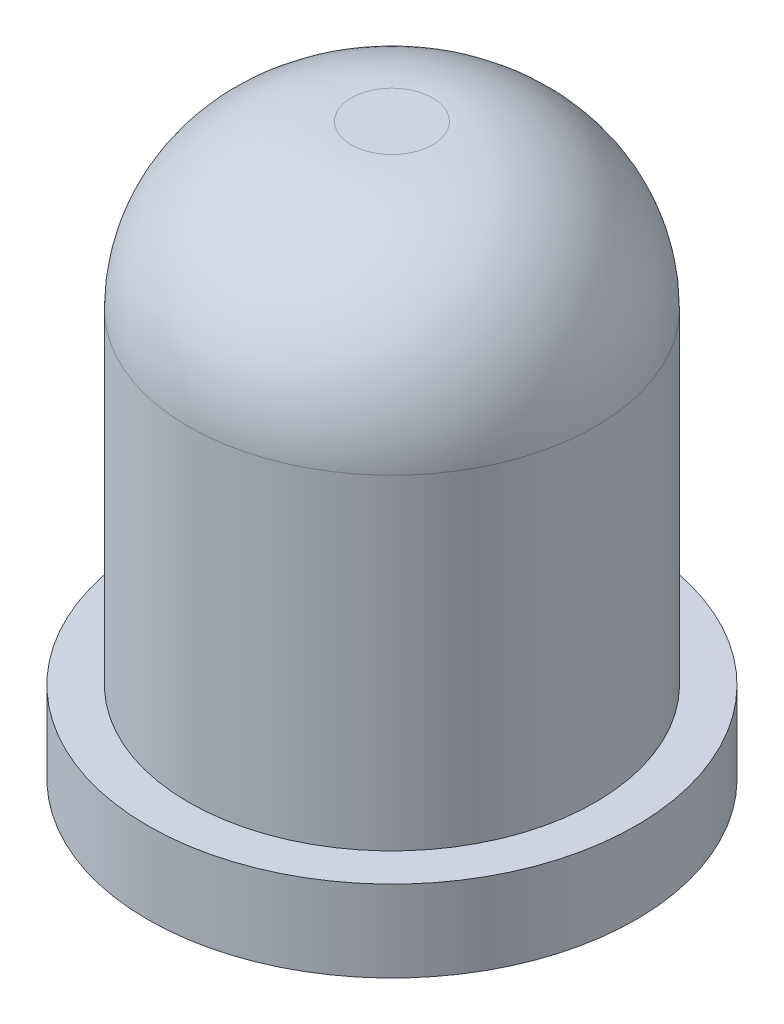
ISO-10303-21;
HEADER;
FILE_DESCRIPTION(('STEP AP214'),'2;1');
FILE_NAME('part.step','',(''),(''),'','','');
FILE_SCHEMA(('AUTOMOTIVE_DESIGN { 1 0 10303 214 1 1 1 1 }'));
ENDSEC;
DATA;
#1=APPLICATION_CONTEXT('core data for automotive mechanical design processes');
#2=APPLICATION_PROTOCOL_DEFINITION('international standard','automotive_design',2000,#1);
#3=PRODUCT_CONTEXT('',#1,'mechanical');
#4=PRODUCT('Part','Part','',(#3));
#5=PRODUCT_RELATED_PRODUCT_CATEGORY('part','',(#4));
#6=PRODUCT_DEFINITION_FORMATION('','',#4);
#7=PRODUCT_DEFINITION_CONTEXT('part definition',#1,'design');
#8=PRODUCT_DEFINITION('design','',#6,#7);
#9=PRODUCT_DEFINITION_SHAPE('','',#8);
#10=(LENGTH_UNIT() NAMED_UNIT(*) SI_UNIT(.MILLI.,.METRE.));
#11=(NAMED_UNIT(*) PLANE_ANGLE_UNIT() SI_UNIT($,.RADIAN.));
#12=(NAMED_UNIT(*) SI_UNIT($,.STERADIAN.) SOLID_ANGLE_UNIT());
#13=UNCERTAINTY_MEASURE_WITH_UNIT(LENGTH_MEASURE(1.E-05),#10,'distance_accuracy_value','');
#14=(GEOMETRIC_REPRESENTATION_CONTEXT(3) GLOBAL_UNCERTAINTY_ASSIGNED_CONTEXT((#13)) GLOBAL_UNIT_ASSIGNED_CONTEXT((#10,
#11,#12)) REPRESENTATION_CONTEXT('',''));
#15=CARTESIAN_POINT('',(0.,0.,0.));
#16=DIRECTION('',(0.,0.,1.));
#17=DIRECTION('',(1.,0.,0.));
#18=AXIS2_PLACEMENT_3D('',#15,#16,#17);
#19=CARTESIAN_POINT('',(0.,1.,0.));
#20=DIRECTION('',(0.,1.,0.));
#21=DIRECTION('',(0.,0.,1.));
#22=AXIS2_PLACEMENT_3D('',#19,#20,#21);
#23=PLANE('',#22);
#24=CARTESIAN_POINT('',(0.,1.,0.));
#25=DIRECTION('',(0.,1.,0.));
#26=DIRECTION('',(0.,0.,1.));
#27=AXIS2_PLACEMENT_3D('',#24,#25,#26);
#28=CIRCLE('',#27,3.);
#29=CARTESIAN_POINT('',(0.,1.,3.));
#30=VERTEX_POINT('',#29);
#31=EDGE_CURVE('E43',#30,#30,#28,.T.);
#32=ORIENTED_EDGE('',*,*,#31,.T.);
#33=EDGE_LOOP('',(#32));
#34=FACE_BOUND('',#33,.T.);
#35=CARTESIAN_POINT('',(0.,1.,0.));
#36=DIRECTION('',(0.,1.,0.));
#37=DIRECTION('',(0.,0.,1.));
#38=AXIS2_PLACEMENT_3D('',#35,#36,#37);
#39=CIRCLE('',#38,2.5);
#40=CARTESIAN_POINT('',(0.,1.,2.5));
#41=VERTEX_POINT('',#40);
#42=EDGE_CURVE('E51',#41,#41,#39,.T.);
#43=ORIENTED_EDGE('',*,*,#42,.F.);
#44=EDGE_LOOP('',(#43));
#45=FACE_BOUND('',#44,.T.);
#46=ADVANCED_FACE('F32',(#34,#45),#23,.T.);
#47=CARTESIAN_POINT('',(0.,1.,0.));
#48=DIRECTION('',(0.,-1.,0.));
#49=DIRECTION('',(0.,0.,-1.));
#50=AXIS2_PLACEMENT_3D('',#47,#48,#49);
#51=CYLINDRICAL_SURFACE('',#50,3.);
#52=ORIENTED_EDGE('',*,*,#31,.F.);
#53=EDGE_LOOP('',(#52));
#54=FACE_BOUND('',#53,.T.);
#55=CARTESIAN_POINT('',(0.,0.,0.));
#56=DIRECTION('',(0.,1.,0.));
#57=DIRECTION('',(0.,0.,1.));
#58=AXIS2_PLACEMENT_3D('',#55,#56,#57);
#59=CIRCLE('',#58,3.);
#60=CARTESIAN_POINT('',(0.,0.,3.));
#61=VERTEX_POINT('',#60);
#62=EDGE_CURVE('E47',#61,#61,#59,.T.);
#63=ORIENTED_EDGE('',*,*,#62,.T.);
#64=EDGE_LOOP('',(#63));
#65=FACE_BOUND('',#64,.T.);
#66=ADVANCED_FACE('F59',(#54,#65),#51,.T.);
#67=CARTESIAN_POINT('',(0.,0.,0.));
#68=DIRECTION('',(0.,1.,0.));
#69=DIRECTION('',(0.,0.,1.));
#70=AXIS2_PLACEMENT_3D('',#67,#68,#69);
#71=PLANE('',#70);
#72=ORIENTED_EDGE('',*,*,#62,.F.);
#73=EDGE_LOOP('',(#72));
#74=FACE_BOUND('',#73,.T.);
#75=ADVANCED_FACE('F65',(#74),#71,.F.);
#76=CARTESIAN_POINT('',(0.,7.,0.));
#77=DIRECTION('',(0.,-1.,0.));
#78=DIRECTION('',(0.,0.,-1.));
#79=AXIS2_PLACEMENT_3D('',#76,#77,#78);
#80=CYLINDRICAL_SURFACE('',#79,2.5);
#81=CARTESIAN_POINT('',(0.,5.,0.));
#82=DIRECTION('',(0.,1.,0.));
#83=DIRECTION('',(0.,0.,1.));
#84=AXIS2_PLACEMENT_3D('',#81,#82,#83);
#85=CIRCLE('',#84,2.5);
#86=CARTESIAN_POINT('',(0.,5.,2.5));
#87=VERTEX_POINT('',#86);
#88=EDGE_CURVE('E10',#87,#87,#85,.F.);
#89=ORIENTED_EDGE('',*,*,#88,.T.);
#90=EDGE_LOOP('',(#89));
#91=FACE_BOUND('',#90,.T.);
#92=ORIENTED_EDGE('',*,*,#42,.T.);
#93=EDGE_LOOP('',(#92));
#94=FACE_BOUND('',#93,.T.);
#95=ADVANCED_FACE('F56',(#91,#94),#80,.T.);
#96=CARTESIAN_POINT('',(0.,7.,0.));
#97=DIRECTION('',(0.,1.,0.));
#98=DIRECTION('',(0.,0.,1.));
#99=AXIS2_PLACEMENT_3D('',#96,#97,#98);
#100=PLANE('',#99);
#101=CARTESIAN_POINT('',(0.,7.,0.));
#102=DIRECTION('',(0.,1.,0.));
#103=DIRECTION('',(0.,0.,1.));
#104=AXIS2_PLACEMENT_3D('',#101,#102,#103);
#105=CIRCLE('',#104,0.5);
#106=CARTESIAN_POINT('',(0.,7.,0.5));
#107=VERTEX_POINT('',#106);
#108=EDGE_CURVE('E39',#107,#107,#105,.T.);
#109=ORIENTED_EDGE('',*,*,#108,.T.);
#110=EDGE_LOOP('',(#109));
#111=FACE_BOUND('',#110,.T.);
#112=ADVANCED_FACE('F75',(#111),#100,.T.);
#113=CARTESIAN_POINT('',(0.,5.,0.));
#114=DIRECTION('',(0.,1.,0.));
#115=DIRECTION('',(0.,0.,1.));
#116=AXIS2_PLACEMENT_3D('',#113,#114,#115);
#117=DEGENERATE_TOROIDAL_SURFACE('',#116,0.5,2.,.T.);
#118=ORIENTED_EDGE('',*,*,#88,.F.);
#119=EDGE_LOOP('',(#118));
#120=FACE_BOUND('',#119,.T.);
#121=ORIENTED_EDGE('',*,*,#108,.F.);
#122=EDGE_LOOP('',(#121));
#123=FACE_BOUND('',#122,.T.);
#124=ADVANCED_FACE('F34',(#120,#123),#117,.T.);
#125=CLOSED_SHELL('',(#46,#66,#75,#95,#112,#124));
#126=MANIFOLD_SOLID_BREP('B2',#125);
#127=ADVANCED_BREP_SHAPE_REPRESENTATION('',(#18,#126),#14);
#128=SHAPE_DEFINITION_REPRESENTATION(#9,#127);
ENDSEC;
END-ISO-10303-21;
